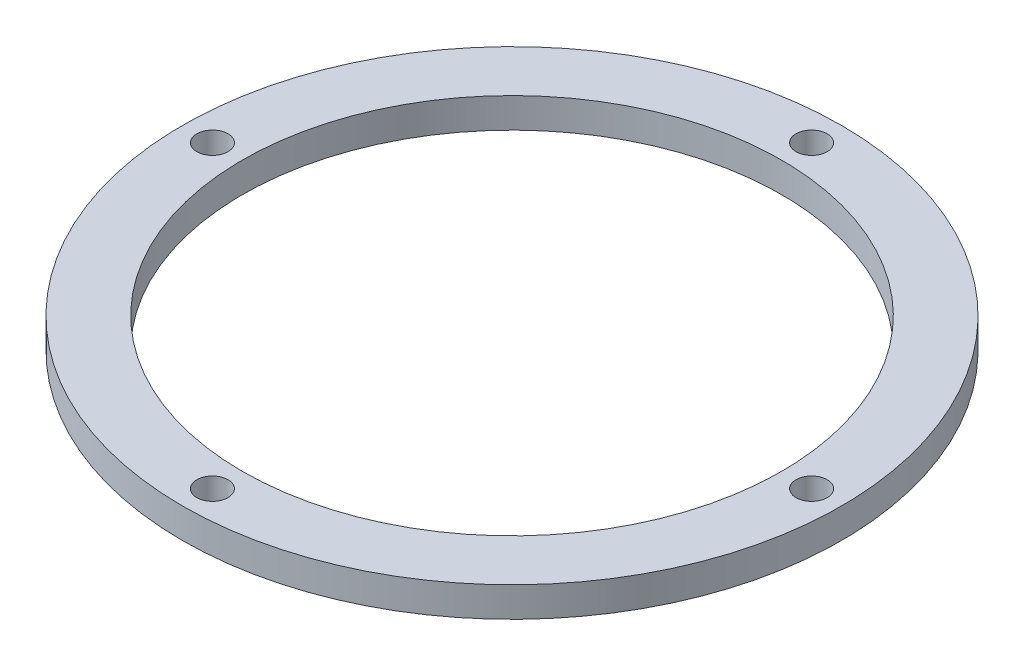
ISO-10303-21;
HEADER;
FILE_DESCRIPTION(('STEP AP214'),'2;1');
FILE_NAME('part.step','',(''),(''),'','','');
FILE_SCHEMA(('AUTOMOTIVE_DESIGN { 1 0 10303 214 1 1 1 1 }'));
ENDSEC;
DATA;
#1=APPLICATION_CONTEXT('core data for automotive mechanical design processes');
#2=APPLICATION_PROTOCOL_DEFINITION('international standard','automotive_design',2000,#1);
#3=PRODUCT_CONTEXT('',#1,'mechanical');
#4=PRODUCT('Part','Part','',(#3));
#5=PRODUCT_RELATED_PRODUCT_CATEGORY('part','',(#4));
#6=PRODUCT_DEFINITION_FORMATION('','',#4);
#7=PRODUCT_DEFINITION_CONTEXT('part definition',#1,'design');
#8=PRODUCT_DEFINITION('design','',#6,#7);
#9=PRODUCT_DEFINITION_SHAPE('','',#8);
#10=(LENGTH_UNIT() NAMED_UNIT(*) SI_UNIT(.MILLI.,.METRE.));
#11=(NAMED_UNIT(*) PLANE_ANGLE_UNIT() SI_UNIT($,.RADIAN.));
#12=(NAMED_UNIT(*) SI_UNIT($,.STERADIAN.) SOLID_ANGLE_UNIT());
#13=UNCERTAINTY_MEASURE_WITH_UNIT(LENGTH_MEASURE(1.E-05),#10,'distance_accuracy_value','');
#14=(GEOMETRIC_REPRESENTATION_CONTEXT(3) GLOBAL_UNCERTAINTY_ASSIGNED_CONTEXT((#13)) GLOBAL_UNIT_ASSIGNED_CONTEXT((#10,
#11,#12)) REPRESENTATION_CONTEXT('',''));
#15=CARTESIAN_POINT('',(0.,0.,0.));
#16=DIRECTION('',(0.,0.,1.));
#17=DIRECTION('',(1.,0.,0.));
#18=AXIS2_PLACEMENT_3D('',#15,#16,#17);
#19=CARTESIAN_POINT('',(0.,5.,0.));
#20=DIRECTION('',(0.,1.,0.));
#21=DIRECTION('',(0.,0.,1.));
#22=AXIS2_PLACEMENT_3D('',#19,#20,#21);
#23=PLANE('',#22);
#24=CARTESIAN_POINT('',(2.81829033045703E-11,5.,50.));
#25=DIRECTION('',(0.,1.,0.));
#26=DIRECTION('',(0.,0.,1.));
#27=AXIS2_PLACEMENT_3D('',#24,#25,#26);
#28=CIRCLE('',#27,2.6);
#29=CARTESIAN_POINT('',(2.81829033045703E-11,5.,52.6));
#30=VERTEX_POINT('',#29);
#31=EDGE_CURVE('E78',#30,#30,#28,.T.);
#32=ORIENTED_EDGE('',*,*,#31,.F.);
#33=EDGE_LOOP('',(#32));
#34=FACE_BOUND('',#33,.T.);
#35=CARTESIAN_POINT('',(0.,5.,-50.));
#36=DIRECTION('',(0.,1.,0.));
#37=DIRECTION('',(0.,0.,1.));
#38=AXIS2_PLACEMENT_3D('',#35,#36,#37);
#39=CIRCLE('',#38,2.6);
#40=CARTESIAN_POINT('',(0.,5.,-47.4));
#41=VERTEX_POINT('',#40);
#42=EDGE_CURVE('E62',#41,#41,#39,.T.);
#43=ORIENTED_EDGE('',*,*,#42,.F.);
#44=EDGE_LOOP('',(#43));
#45=FACE_BOUND('',#44,.T.);
#46=CARTESIAN_POINT('',(0.,5.,0.));
#47=DIRECTION('',(0.,1.,0.));
#48=DIRECTION('',(0.,0.,1.));
#49=AXIS2_PLACEMENT_3D('',#46,#47,#48);
#50=CIRCLE('',#49,55.);
#51=CARTESIAN_POINT('',(0.,5.,55.));
#52=VERTEX_POINT('',#51);
#53=EDGE_CURVE('E10',#52,#52,#50,.T.);
#54=ORIENTED_EDGE('',*,*,#53,.T.);
#55=EDGE_LOOP('',(#54));
#56=FACE_BOUND('',#55,.T.);
#57=CARTESIAN_POINT('',(0.,5.,0.));
#58=DIRECTION('',(0.,1.,0.));
#59=DIRECTION('',(0.,0.,1.));
#60=AXIS2_PLACEMENT_3D('',#57,#58,#59);
#61=CIRCLE('',#60,45.);
#62=CARTESIAN_POINT('',(0.,5.,45.));
#63=VERTEX_POINT('',#62);
#64=EDGE_CURVE('E56',#63,#63,#61,.T.);
#65=ORIENTED_EDGE('',*,*,#64,.F.);
#66=EDGE_LOOP('',(#65));
#67=FACE_BOUND('',#66,.T.);
#68=CARTESIAN_POINT('',(50.0000000000141,5.,-1.40914516522851E-11));
#69=DIRECTION('',(0.,1.,0.));
#70=DIRECTION('',(0.,0.,1.));
#71=AXIS2_PLACEMENT_3D('',#68,#69,#70);
#72=CIRCLE('',#71,2.6);
#73=CARTESIAN_POINT('',(50.0000000000141,5.,2.5999999999859));
#74=VERTEX_POINT('',#73);
#75=EDGE_CURVE('E70',#74,#74,#72,.T.);
#76=ORIENTED_EDGE('',*,*,#75,.F.);
#77=EDGE_LOOP('',(#76));
#78=FACE_BOUND('',#77,.T.);
#79=CARTESIAN_POINT('',(-49.9999999999859,5.,1.40975748862809E-11));
#80=DIRECTION('',(0.,1.,0.));
#81=DIRECTION('',(0.,0.,1.));
#82=AXIS2_PLACEMENT_3D('',#79,#80,#81);
#83=CIRCLE('',#82,2.6);
#84=CARTESIAN_POINT('',(-49.9999999999859,5.,2.60000000001409));
#85=VERTEX_POINT('',#84);
#86=EDGE_CURVE('E86',#85,#85,#83,.T.);
#87=ORIENTED_EDGE('',*,*,#86,.F.);
#88=EDGE_LOOP('',(#87));
#89=FACE_BOUND('',#88,.T.);
#90=ADVANCED_FACE('F41',(#34,#45,#56,#67,#78,#89),#23,.T.);
#91=CARTESIAN_POINT('',(0.,0.,0.));
#92=DIRECTION('',(0.,1.,0.));
#93=DIRECTION('',(0.,0.,1.));
#94=AXIS2_PLACEMENT_3D('',#91,#92,#93);
#95=PLANE('',#94);
#96=CARTESIAN_POINT('',(0.,0.,0.));
#97=DIRECTION('',(0.,1.,0.));
#98=DIRECTION('',(0.,0.,1.));
#99=AXIS2_PLACEMENT_3D('',#96,#97,#98);
#100=CIRCLE('',#99,55.);
#101=CARTESIAN_POINT('',(0.,0.,55.));
#102=VERTEX_POINT('',#101);
#103=EDGE_CURVE('E45',#102,#102,#100,.T.);
#104=ORIENTED_EDGE('',*,*,#103,.F.);
#105=EDGE_LOOP('',(#104));
#106=FACE_BOUND('',#105,.T.);
#107=CARTESIAN_POINT('',(0.,0.,0.));
#108=DIRECTION('',(0.,1.,0.));
#109=DIRECTION('',(0.,0.,1.));
#110=AXIS2_PLACEMENT_3D('',#107,#108,#109);
#111=CIRCLE('',#110,45.);
#112=CARTESIAN_POINT('',(0.,0.,45.));
#113=VERTEX_POINT('',#112);
#114=EDGE_CURVE('E58',#113,#113,#111,.T.);
#115=ORIENTED_EDGE('',*,*,#114,.T.);
#116=EDGE_LOOP('',(#115));
#117=FACE_BOUND('',#116,.T.);
#118=CARTESIAN_POINT('',(0.,0.,-50.));
#119=DIRECTION('',(0.,1.,0.));
#120=DIRECTION('',(0.,0.,1.));
#121=AXIS2_PLACEMENT_3D('',#118,#119,#120);
#122=CIRCLE('',#121,2.6);
#123=CARTESIAN_POINT('',(0.,0.,-47.4));
#124=VERTEX_POINT('',#123);
#125=EDGE_CURVE('E66',#124,#124,#122,.T.);
#126=ORIENTED_EDGE('',*,*,#125,.T.);
#127=EDGE_LOOP('',(#126));
#128=FACE_BOUND('',#127,.T.);
#129=CARTESIAN_POINT('',(50.0000000000141,0.,-1.40914516522851E-11));
#130=DIRECTION('',(0.,1.,0.));
#131=DIRECTION('',(0.,0.,1.));
#132=AXIS2_PLACEMENT_3D('',#129,#130,#131);
#133=CIRCLE('',#132,2.6);
#134=CARTESIAN_POINT('',(50.0000000000141,0.,2.5999999999859));
#135=VERTEX_POINT('',#134);
#136=EDGE_CURVE('E74',#135,#135,#133,.T.);
#137=ORIENTED_EDGE('',*,*,#136,.T.);
#138=EDGE_LOOP('',(#137));
#139=FACE_BOUND('',#138,.T.);
#140=CARTESIAN_POINT('',(2.81829033045703E-11,0.,50.));
#141=DIRECTION('',(0.,1.,0.));
#142=DIRECTION('',(0.,0.,1.));
#143=AXIS2_PLACEMENT_3D('',#140,#141,#142);
#144=CIRCLE('',#143,2.6);
#145=CARTESIAN_POINT('',(2.81829033045703E-11,0.,52.6));
#146=VERTEX_POINT('',#145);
#147=EDGE_CURVE('E82',#146,#146,#144,.T.);
#148=ORIENTED_EDGE('',*,*,#147,.T.);
#149=EDGE_LOOP('',(#148));
#150=FACE_BOUND('',#149,.T.);
#151=CARTESIAN_POINT('',(-49.9999999999859,0.,1.40975748862809E-11));
#152=DIRECTION('',(0.,1.,0.));
#153=DIRECTION('',(0.,0.,1.));
#154=AXIS2_PLACEMENT_3D('',#151,#152,#153);
#155=CIRCLE('',#154,2.6);
#156=CARTESIAN_POINT('',(-49.9999999999859,0.,2.60000000001409));
#157=VERTEX_POINT('',#156);
#158=EDGE_CURVE('E90',#157,#157,#155,.T.);
#159=ORIENTED_EDGE('',*,*,#158,.T.);
#160=EDGE_LOOP('',(#159));
#161=FACE_BOUND('',#160,.T.);
#162=ADVANCED_FACE('F104',(#106,#117,#128,#139,#150,#161),#95,.F.);
#163=CARTESIAN_POINT('',(0.,5.,0.));
#164=DIRECTION('',(0.,-1.,0.));
#165=DIRECTION('',(0.,0.,-1.));
#166=AXIS2_PLACEMENT_3D('',#163,#164,#165);
#167=CYLINDRICAL_SURFACE('',#166,55.);
#168=ORIENTED_EDGE('',*,*,#53,.F.);
#169=EDGE_LOOP('',(#168));
#170=FACE_BOUND('',#169,.T.);
#171=ORIENTED_EDGE('',*,*,#103,.T.);
#172=EDGE_LOOP('',(#171));
#173=FACE_BOUND('',#172,.T.);
#174=ADVANCED_FACE('F43',(#170,#173),#167,.T.);
#175=CARTESIAN_POINT('',(0.,5.,0.));
#176=DIRECTION('',(0.,-1.,0.));
#177=DIRECTION('',(0.,0.,-1.));
#178=AXIS2_PLACEMENT_3D('',#175,#176,#177);
#179=CYLINDRICAL_SURFACE('',#178,45.);
#180=ORIENTED_EDGE('',*,*,#64,.T.);
#181=EDGE_LOOP('',(#180));
#182=FACE_BOUND('',#181,.T.);
#183=ORIENTED_EDGE('',*,*,#114,.F.);
#184=EDGE_LOOP('',(#183));
#185=FACE_BOUND('',#184,.T.);
#186=ADVANCED_FACE('F114',(#182,#185),#179,.F.);
#187=CARTESIAN_POINT('',(0.,5.,-50.));
#188=DIRECTION('',(0.,-1.,0.));
#189=DIRECTION('',(0.,0.,-1.));
#190=AXIS2_PLACEMENT_3D('',#187,#188,#189);
#191=CYLINDRICAL_SURFACE('',#190,2.6);
#192=ORIENTED_EDGE('',*,*,#42,.T.);
#193=EDGE_LOOP('',(#192));
#194=FACE_BOUND('',#193,.T.);
#195=ORIENTED_EDGE('',*,*,#125,.F.);
#196=EDGE_LOOP('',(#195));
#197=FACE_BOUND('',#196,.T.);
#198=ADVANCED_FACE('F117',(#194,#197),#191,.F.);
#199=CARTESIAN_POINT('',(50.0000000000141,5.,-1.40914516522851E-11));
#200=DIRECTION('',(0.,-1.,0.));
#201=DIRECTION('',(0.,0.,-1.));
#202=AXIS2_PLACEMENT_3D('',#199,#200,#201);
#203=CYLINDRICAL_SURFACE('',#202,2.6);
#204=ORIENTED_EDGE('',*,*,#75,.T.);
#205=EDGE_LOOP('',(#204));
#206=FACE_BOUND('',#205,.T.);
#207=ORIENTED_EDGE('',*,*,#136,.F.);
#208=EDGE_LOOP('',(#207));
#209=FACE_BOUND('',#208,.T.);
#210=ADVANCED_FACE('F121',(#206,#209),#203,.F.);
#211=CARTESIAN_POINT('',(2.81829033045703E-11,5.,50.));
#212=DIRECTION('',(0.,-1.,0.));
#213=DIRECTION('',(0.,0.,-1.));
#214=AXIS2_PLACEMENT_3D('',#211,#212,#213);
#215=CYLINDRICAL_SURFACE('',#214,2.6);
#216=ORIENTED_EDGE('',*,*,#31,.T.);
#217=EDGE_LOOP('',(#216));
#218=FACE_BOUND('',#217,.T.);
#219=ORIENTED_EDGE('',*,*,#147,.F.);
#220=EDGE_LOOP('',(#219));
#221=FACE_BOUND('',#220,.T.);
#222=ADVANCED_FACE('F125',(#218,#221),#215,.F.);
#223=CARTESIAN_POINT('',(-49.9999999999859,5.,1.40975748862809E-11));
#224=DIRECTION('',(0.,-1.,0.));
#225=DIRECTION('',(0.,0.,-1.));
#226=AXIS2_PLACEMENT_3D('',#223,#224,#225);
#227=CYLINDRICAL_SURFACE('',#226,2.6);
#228=ORIENTED_EDGE('',*,*,#86,.T.);
#229=EDGE_LOOP('',(#228));
#230=FACE_BOUND('',#229,.T.);
#231=ORIENTED_EDGE('',*,*,#158,.F.);
#232=EDGE_LOOP('',(#231));
#233=FACE_BOUND('',#232,.T.);
#234=ADVANCED_FACE('F100',(#230,#233),#227,.F.);
#235=CLOSED_SHELL('',(#90,#162,#174,#186,#198,#210,#222,#234));
#236=MANIFOLD_SOLID_BREP('B2',#235);
#237=ADVANCED_BREP_SHAPE_REPRESENTATION('',(#18,#236),#14);
#238=SHAPE_DEFINITION_REPRESENTATION(#9,#237);
ENDSEC;
END-ISO-10303-21;
